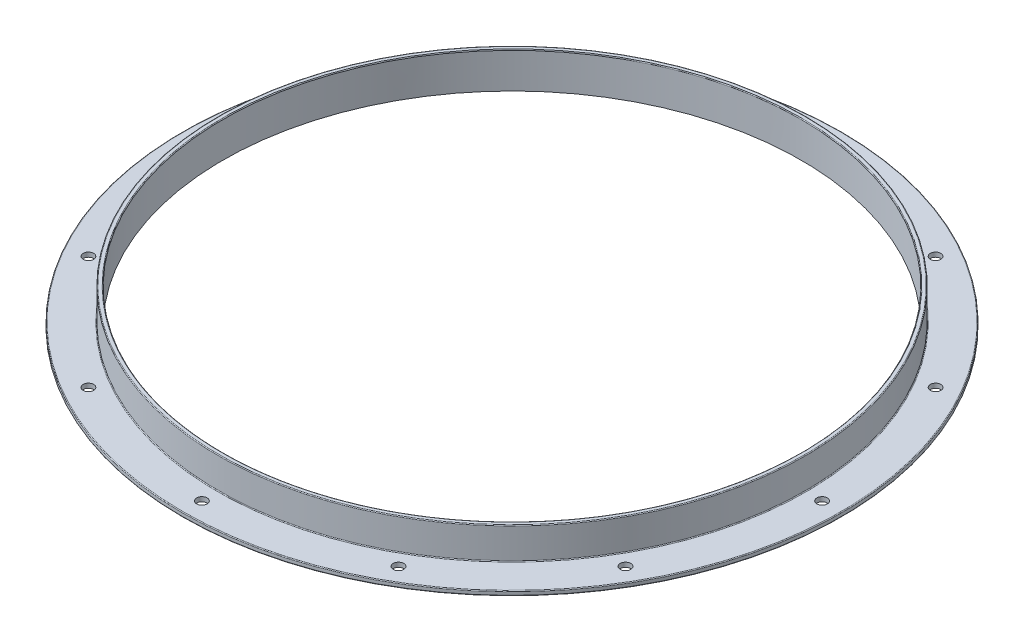
ISO-10303-21;
HEADER;
FILE_DESCRIPTION(('STEP AP214'),'2;1');
FILE_NAME('part.step','',(''),(''),'','','');
FILE_SCHEMA(('AUTOMOTIVE_DESIGN { 1 0 10303 214 1 1 1 1 }'));
ENDSEC;
DATA;
#1=APPLICATION_CONTEXT('core data for automotive mechanical design processes');
#2=APPLICATION_PROTOCOL_DEFINITION('international standard','automotive_design',2000,#1);
#3=PRODUCT_CONTEXT('',#1,'mechanical');
#4=PRODUCT('Part','Part','',(#3));
#5=PRODUCT_RELATED_PRODUCT_CATEGORY('part','',(#4));
#6=PRODUCT_DEFINITION_FORMATION('','',#4);
#7=PRODUCT_DEFINITION_CONTEXT('part definition',#1,'design');
#8=PRODUCT_DEFINITION('design','',#6,#7);
#9=PRODUCT_DEFINITION_SHAPE('','',#8);
#10=(LENGTH_UNIT() NAMED_UNIT(*) SI_UNIT(.MILLI.,.METRE.));
#11=(NAMED_UNIT(*) PLANE_ANGLE_UNIT() SI_UNIT($,.RADIAN.));
#12=(NAMED_UNIT(*) SI_UNIT($,.STERADIAN.) SOLID_ANGLE_UNIT());
#13=UNCERTAINTY_MEASURE_WITH_UNIT(LENGTH_MEASURE(1.E-05),#10,'distance_accuracy_value','');
#14=(GEOMETRIC_REPRESENTATION_CONTEXT(3) GLOBAL_UNCERTAINTY_ASSIGNED_CONTEXT((#13)) GLOBAL_UNIT_ASSIGNED_CONTEXT((#10,
#11,#12)) REPRESENTATION_CONTEXT('',''));
#15=CARTESIAN_POINT('',(0.,0.,0.));
#16=DIRECTION('',(0.,0.,1.));
#17=DIRECTION('',(1.,0.,0.));
#18=AXIS2_PLACEMENT_3D('',#15,#16,#17);
#19=CARTESIAN_POINT('',(0.,38.1,0.));
#20=DIRECTION('',(0.,1.,0.));
#21=DIRECTION('',(0.,0.,1.));
#22=AXIS2_PLACEMENT_3D('',#19,#20,#21);
#23=CYLINDRICAL_SURFACE('',#22,349.25);
#24=CARTESIAN_POINT('',(0.,0.793749999999989,0.));
#25=DIRECTION('',(0.,1.,0.));
#26=DIRECTION('',(0.,0.,1.));
#27=AXIS2_PLACEMENT_3D('',#24,#25,#26);
#28=CIRCLE('',#27,349.25);
#29=CARTESIAN_POINT('',(0.,0.793749999999975,349.25));
#30=VERTEX_POINT('',#29);
#31=EDGE_CURVE('E66',#30,#30,#28,.T.);
#32=ORIENTED_EDGE('',*,*,#31,.T.);
#33=EDGE_LOOP('',(#32));
#34=FACE_BOUND('',#33,.T.);
#35=CARTESIAN_POINT('',(0.,3.96874999999998,0.));
#36=DIRECTION('',(0.,-1.,0.));
#37=DIRECTION('',(0.,0.,-1.));
#38=AXIS2_PLACEMENT_3D('',#35,#36,#37);
#39=CIRCLE('',#38,349.25);
#40=CARTESIAN_POINT('',(0.,3.96874999999999,-349.25));
#41=VERTEX_POINT('',#40);
#42=EDGE_CURVE('E69',#41,#41,#39,.T.);
#43=ORIENTED_EDGE('',*,*,#42,.T.);
#44=EDGE_LOOP('',(#43));
#45=FACE_BOUND('',#44,.T.);
#46=ADVANCED_FACE('F34',(#34,#45),#23,.T.);
#47=CARTESIAN_POINT('',(0.,4.76249999999999,-349.25));
#48=DIRECTION('',(0.,-1.,0.));
#49=DIRECTION('',(0.,0.,-1.));
#50=AXIS2_PLACEMENT_3D('',#47,#48,#49);
#51=PLANE('',#50);
#52=CARTESIAN_POINT('',(164.306249999996,4.76249999999997,-284.586773001116));
#53=DIRECTION('',(0.,1.,0.));
#54=DIRECTION('',(-0.499999999999989,0.,0.866025403784445));
#55=AXIS2_PLACEMENT_3D('',#52,#53,#54);
#56=CIRCLE('',#55,5.55625000000002);
#57=CARTESIAN_POINT('',(161.528124999996,4.76249999999997,-279.774919351339));
#58=VERTEX_POINT('',#57);
#59=EDGE_CURVE('E142',#58,#58,#56,.T.);
#60=ORIENTED_EDGE('',*,*,#59,.F.);
#61=EDGE_LOOP('',(#60));
#62=FACE_BOUND('',#61,.T.);
#63=CARTESIAN_POINT('',(284.586773001112,4.76249999999997,-164.306250000003));
#64=DIRECTION('',(0.,1.,0.));
#65=DIRECTION('',(-0.866025403784433,0.,0.50000000000001));
#66=AXIS2_PLACEMENT_3D('',#63,#64,#65);
#67=CIRCLE('',#66,5.55625000000002);
#68=CARTESIAN_POINT('',(279.030523001112,4.76249999999997,-164.306250000003));
#69=VERTEX_POINT('',#68);
#70=EDGE_CURVE('E136',#69,#69,#67,.T.);
#71=ORIENTED_EDGE('',*,*,#70,.F.);
#72=EDGE_LOOP('',(#71));
#73=FACE_BOUND('',#72,.T.);
#74=CARTESIAN_POINT('',(328.6125,4.76249999999996,-3.4418388217024E-12));
#75=DIRECTION('',(0.,1.,0.));
#76=DIRECTION('',(-1.,0.,0.));
#77=AXIS2_PLACEMENT_3D('',#74,#75,#76);
#78=CIRCLE('',#77,5.55625000000002);
#79=CARTESIAN_POINT('',(323.05625,4.76249999999996,-3.38364019213556E-12));
#80=VERTEX_POINT('',#79);
#81=EDGE_CURVE('E130',#80,#80,#78,.T.);
#82=ORIENTED_EDGE('',*,*,#81,.F.);
#83=EDGE_LOOP('',(#82));
#84=FACE_BOUND('',#83,.T.);
#85=CARTESIAN_POINT('',(284.586773001115,4.76249999999995,164.306249999997));
#86=DIRECTION('',(0.,1.,0.));
#87=DIRECTION('',(-0.866025403784443,0.,-0.499999999999992));
#88=AXIS2_PLACEMENT_3D('',#85,#86,#87);
#89=CIRCLE('',#88,5.55625000000002);
#90=CARTESIAN_POINT('',(279.774919351338,4.76249999999995,161.528124999997));
#91=VERTEX_POINT('',#90);
#92=EDGE_CURVE('E124',#91,#91,#89,.T.);
#93=ORIENTED_EDGE('',*,*,#92,.F.);
#94=EDGE_LOOP('',(#93));
#95=FACE_BOUND('',#94,.T.);
#96=CARTESIAN_POINT('',(164.306250000002,4.76249999999995,284.586773001113));
#97=DIRECTION('',(0.,1.,0.));
#98=DIRECTION('',(-0.500000000000007,0.,-0.866025403784435));
#99=AXIS2_PLACEMENT_3D('',#96,#97,#98);
#100=CIRCLE('',#99,5.55625000000002);
#101=CARTESIAN_POINT('',(161.528125000002,4.76249999999995,279.774919351335));
#102=VERTEX_POINT('',#101);
#103=EDGE_CURVE('E118',#102,#102,#100,.T.);
#104=ORIENTED_EDGE('',*,*,#103,.F.);
#105=EDGE_LOOP('',(#104));
#106=FACE_BOUND('',#105,.T.);
#107=CARTESIAN_POINT('',(0.,4.76249999999995,328.6125));
#108=DIRECTION('',(0.,1.,0.));
#109=DIRECTION('',(0.,0.,-1.));
#110=AXIS2_PLACEMENT_3D('',#107,#108,#109);
#111=CIRCLE('',#110,5.55625000000002);
#112=CARTESIAN_POINT('',(0.,4.76249999999995,323.05625));
#113=VERTEX_POINT('',#112);
#114=EDGE_CURVE('E112',#113,#113,#111,.T.);
#115=ORIENTED_EDGE('',*,*,#114,.F.);
#116=EDGE_LOOP('',(#115));
#117=FACE_BOUND('',#116,.T.);
#118=CARTESIAN_POINT('',(-164.306249999998,4.76249999999995,284.586773001115));
#119=DIRECTION('',(0.,1.,0.));
#120=DIRECTION('',(0.499999999999995,0.,-0.866025403784442));
#121=AXIS2_PLACEMENT_3D('',#118,#119,#120);
#122=CIRCLE('',#121,5.55625000000002);
#123=CARTESIAN_POINT('',(-161.528124999998,4.76249999999995,279.774919351337));
#124=VERTEX_POINT('',#123);
#125=EDGE_CURVE('E106',#124,#124,#122,.T.);
#126=ORIENTED_EDGE('',*,*,#125,.F.);
#127=EDGE_LOOP('',(#126));
#128=FACE_BOUND('',#127,.T.);
#129=CARTESIAN_POINT('',(-284.586773001113,4.76249999999995,164.306250000001));
#130=DIRECTION('',(0.,1.,0.));
#131=DIRECTION('',(0.866025403784436,0.,-0.500000000000004));
#132=AXIS2_PLACEMENT_3D('',#129,#130,#131);
#133=CIRCLE('',#132,5.55625000000002);
#134=CARTESIAN_POINT('',(-279.774919351336,4.76249999999995,161.528125000001));
#135=VERTEX_POINT('',#134);
#136=EDGE_CURVE('E100',#135,#135,#133,.T.);
#137=ORIENTED_EDGE('',*,*,#136,.F.);
#138=EDGE_LOOP('',(#137));
#139=FACE_BOUND('',#138,.T.);
#140=CARTESIAN_POINT('',(-328.6125,4.76249999999996,1.14753882413995E-12));
#141=DIRECTION('',(0.,1.,0.));
#142=DIRECTION('',(1.,0.,0.));
#143=AXIS2_PLACEMENT_3D('',#140,#141,#142);
#144=CIRCLE('',#143,5.55625000000002);
#145=CARTESIAN_POINT('',(-323.05625,4.76249999999996,1.12813928095101E-12));
#146=VERTEX_POINT('',#145);
#147=EDGE_CURVE('E94',#146,#146,#144,.T.);
#148=ORIENTED_EDGE('',*,*,#147,.F.);
#149=EDGE_LOOP('',(#148));
#150=FACE_BOUND('',#149,.T.);
#151=CARTESIAN_POINT('',(-284.586773001114,4.76249999999997,-164.306249999999));
#152=DIRECTION('',(0.,1.,0.));
#153=DIRECTION('',(0.86602540378444,0.,0.499999999999998));
#154=AXIS2_PLACEMENT_3D('',#151,#152,#153);
#155=CIRCLE('',#154,5.55625000000002);
#156=CARTESIAN_POINT('',(-290.143023001114,4.76249999999997,-164.306249999999));
#157=VERTEX_POINT('',#156);
#158=EDGE_CURVE('E88',#157,#157,#155,.T.);
#159=ORIENTED_EDGE('',*,*,#158,.F.);
#160=EDGE_LOOP('',(#159));
#161=FACE_BOUND('',#160,.T.);
#162=CARTESIAN_POINT('',(-164.30625,4.76249999999997,-284.586773001114));
#163=DIRECTION('',(0.,1.,0.));
#164=DIRECTION('',(0.500000000000001,0.,0.866025403784438));
#165=AXIS2_PLACEMENT_3D('',#162,#163,#164);
#166=CIRCLE('',#165,5.55625000000002);
#167=CARTESIAN_POINT('',(-169.8625,4.76249999999997,-284.586773001114));
#168=VERTEX_POINT('',#167);
#169=EDGE_CURVE('E82',#168,#168,#166,.T.);
#170=ORIENTED_EDGE('',*,*,#169,.F.);
#171=EDGE_LOOP('',(#170));
#172=FACE_BOUND('',#171,.T.);
#173=CARTESIAN_POINT('',(0.,4.76249999999997,-328.6125));
#174=DIRECTION('',(0.,1.,0.));
#175=DIRECTION('',(0.,0.,1.));
#176=AXIS2_PLACEMENT_3D('',#173,#174,#175);
#177=CIRCLE('',#176,5.55625000000002);
#178=CARTESIAN_POINT('',(0.,4.76249999999997,-323.05625));
#179=VERTEX_POINT('',#178);
#180=EDGE_CURVE('E76',#179,#179,#177,.T.);
#181=ORIENTED_EDGE('',*,*,#180,.F.);
#182=EDGE_LOOP('',(#181));
#183=FACE_BOUND('',#182,.T.);
#184=CARTESIAN_POINT('',(0.,4.76249999999998,0.));
#185=DIRECTION('',(0.,-1.,0.));
#186=DIRECTION('',(0.,0.,-1.));
#187=AXIS2_PLACEMENT_3D('',#184,#185,#186);
#188=CIRCLE('',#187,311.94375);
#189=CARTESIAN_POINT('',(0.,4.76249999999999,-311.94375));
#190=VERTEX_POINT('',#189);
#191=EDGE_CURVE('E10',#190,#190,#188,.T.);
#192=ORIENTED_EDGE('',*,*,#191,.T.);
#193=EDGE_LOOP('',(#192));
#194=FACE_BOUND('',#193,.T.);
#195=CARTESIAN_POINT('',(0.,4.76249999999998,0.));
#196=DIRECTION('',(0.,-1.,0.));
#197=DIRECTION('',(0.,0.,-1.));
#198=AXIS2_PLACEMENT_3D('',#195,#196,#197);
#199=CIRCLE('',#198,348.45625);
#200=CARTESIAN_POINT('',(0.,4.76249999999999,-348.45625));
#201=VERTEX_POINT('',#200);
#202=EDGE_CURVE('E60',#201,#201,#199,.F.);
#203=ORIENTED_EDGE('',*,*,#202,.T.);
#204=EDGE_LOOP('',(#203));
#205=FACE_BOUND('',#204,.T.);
#206=ADVANCED_FACE('F158',(#62,#73,#84,#95,#106,#117,#128,#139,#150,#161,#172,#183,#194,#205),
#51,.F.);
#207=CARTESIAN_POINT('',(0.,38.1,0.));
#208=DIRECTION('',(0.,1.,0.));
#209=DIRECTION('',(0.,0.,1.));
#210=AXIS2_PLACEMENT_3D('',#207,#208,#209);
#211=CYLINDRICAL_SURFACE('',#210,311.15);
#212=CARTESIAN_POINT('',(0.,37.30625,0.));
#213=DIRECTION('',(0.,-1.,0.));
#214=DIRECTION('',(0.,0.,-1.));
#215=AXIS2_PLACEMENT_3D('',#212,#213,#214);
#216=CIRCLE('',#215,311.15);
#217=CARTESIAN_POINT('',(0.,37.30625,-311.15));
#218=VERTEX_POINT('',#217);
#219=EDGE_CURVE('E45',#218,#218,#216,.T.);
#220=ORIENTED_EDGE('',*,*,#219,.T.);
#221=EDGE_LOOP('',(#220));
#222=FACE_BOUND('',#221,.T.);
#223=CARTESIAN_POINT('',(0.,5.55624999999998,0.));
#224=DIRECTION('',(0.,-1.,0.));
#225=DIRECTION('',(0.,0.,-1.));
#226=AXIS2_PLACEMENT_3D('',#223,#224,#225);
#227=CIRCLE('',#226,311.15);
#228=CARTESIAN_POINT('',(0.,5.55624999999999,-311.15));
#229=VERTEX_POINT('',#228);
#230=EDGE_CURVE('E49',#229,#229,#227,.F.);
#231=ORIENTED_EDGE('',*,*,#230,.T.);
#232=EDGE_LOOP('',(#231));
#233=FACE_BOUND('',#232,.T.);
#234=ADVANCED_FACE('F161',(#222,#233),#211,.T.);
#235=CARTESIAN_POINT('',(0.,38.1,-311.15));
#236=DIRECTION('',(0.,-1.,0.));
#237=DIRECTION('',(0.,0.,-1.));
#238=AXIS2_PLACEMENT_3D('',#235,#236,#237);
#239=PLANE('',#238);
#240=CARTESIAN_POINT('',(0.,38.1,0.));
#241=DIRECTION('',(0.,-1.,0.));
#242=DIRECTION('',(0.,0.,-1.));
#243=AXIS2_PLACEMENT_3D('',#240,#241,#242);
#244=CIRCLE('',#243,310.35625);
#245=CARTESIAN_POINT('',(0.,38.1,-310.35625));
#246=VERTEX_POINT('',#245);
#247=EDGE_CURVE('E54',#246,#246,#244,.F.);
#248=ORIENTED_EDGE('',*,*,#247,.T.);
#249=EDGE_LOOP('',(#248));
#250=FACE_BOUND('',#249,.T.);
#251=CARTESIAN_POINT('',(0.,38.1,0.));
#252=DIRECTION('',(0.,-1.,0.));
#253=DIRECTION('',(0.,0.,-1.));
#254=AXIS2_PLACEMENT_3D('',#251,#252,#253);
#255=CIRCLE('',#254,307.18125);
#256=CARTESIAN_POINT('',(0.,38.1,-307.18125));
#257=VERTEX_POINT('',#256);
#258=EDGE_CURVE('E57',#257,#257,#255,.T.);
#259=ORIENTED_EDGE('',*,*,#258,.T.);
#260=EDGE_LOOP('',(#259));
#261=FACE_BOUND('',#260,.T.);
#262=ADVANCED_FACE('F212',(#250,#261),#239,.F.);
#263=CARTESIAN_POINT('',(0.,38.1,0.));
#264=DIRECTION('',(0.,1.,0.));
#265=DIRECTION('',(0.,0.,1.));
#266=AXIS2_PLACEMENT_3D('',#263,#264,#265);
#267=CYLINDRICAL_SURFACE('',#266,306.3875);
#268=CARTESIAN_POINT('',(0.,37.30625,0.));
#269=DIRECTION('',(0.,-1.,0.));
#270=DIRECTION('',(0.,0.,-1.));
#271=AXIS2_PLACEMENT_3D('',#268,#269,#270);
#272=CIRCLE('',#271,306.3875);
#273=CARTESIAN_POINT('',(0.,37.30625,-306.3875));
#274=VERTEX_POINT('',#273);
#275=EDGE_CURVE('E41',#274,#274,#272,.F.);
#276=ORIENTED_EDGE('',*,*,#275,.T.);
#277=EDGE_LOOP('',(#276));
#278=FACE_BOUND('',#277,.T.);
#279=CARTESIAN_POINT('',(0.,0.,0.));
#280=DIRECTION('',(0.,1.,0.));
#281=DIRECTION('',(0.,0.,1.));
#282=AXIS2_PLACEMENT_3D('',#279,#280,#281);
#283=CIRCLE('',#282,306.3875);
#284=CARTESIAN_POINT('',(0.,0.,306.3875));
#285=VERTEX_POINT('',#284);
#286=EDGE_CURVE('E72',#285,#285,#283,.T.);
#287=ORIENTED_EDGE('',*,*,#286,.F.);
#288=EDGE_LOOP('',(#287));
#289=FACE_BOUND('',#288,.T.);
#290=ADVANCED_FACE('F216',(#278,#289),#267,.F.);
#291=CARTESIAN_POINT('',(0.,0.,-306.3875));
#292=DIRECTION('',(0.,1.,0.));
#293=DIRECTION('',(0.,0.,1.));
#294=AXIS2_PLACEMENT_3D('',#291,#292,#293);
#295=PLANE('',#294);
#296=CARTESIAN_POINT('',(164.306249999996,0.,-284.586773001116));
#297=DIRECTION('',(0.,1.,0.));
#298=DIRECTION('',(-0.499999999999989,0.,0.866025403784445));
#299=AXIS2_PLACEMENT_3D('',#296,#297,#298);
#300=CIRCLE('',#299,5.55625000000002);
#301=CARTESIAN_POINT('',(161.528124999996,0.,-279.774919351339));
#302=VERTEX_POINT('',#301);
#303=EDGE_CURVE('E139',#302,#302,#300,.T.);
#304=ORIENTED_EDGE('',*,*,#303,.T.);
#305=EDGE_LOOP('',(#304));
#306=FACE_BOUND('',#305,.T.);
#307=CARTESIAN_POINT('',(284.586773001112,0.,-164.306250000003));
#308=DIRECTION('',(0.,1.,0.));
#309=DIRECTION('',(-0.866025403784433,0.,0.50000000000001));
#310=AXIS2_PLACEMENT_3D('',#307,#308,#309);
#311=CIRCLE('',#310,5.55625000000002);
#312=CARTESIAN_POINT('',(279.030523001112,0.,-164.306250000003));
#313=VERTEX_POINT('',#312);
#314=EDGE_CURVE('E133',#313,#313,#311,.T.);
#315=ORIENTED_EDGE('',*,*,#314,.T.);
#316=EDGE_LOOP('',(#315));
#317=FACE_BOUND('',#316,.T.);
#318=CARTESIAN_POINT('',(328.6125,-1.02348685082632E-13,-3.44203323438177E-12));
#319=DIRECTION('',(0.,1.,0.));
#320=DIRECTION('',(-1.,0.,0.));
#321=AXIS2_PLACEMENT_3D('',#318,#319,#320);
#322=CIRCLE('',#321,5.55625000000002);
#323=CARTESIAN_POINT('',(323.05625,-1.01985781414484E-13,-3.38383460481493E-12));
#324=VERTEX_POINT('',#323);
#325=EDGE_CURVE('E127',#324,#324,#322,.T.);
#326=ORIENTED_EDGE('',*,*,#325,.T.);
#327=EDGE_LOOP('',(#326));
#328=FACE_BOUND('',#327,.T.);
#329=CARTESIAN_POINT('',(284.586773001115,-1.17961196366423E-13,164.306249999997));
#330=DIRECTION('',(0.,1.,0.));
#331=DIRECTION('',(-0.866025403784443,0.,-0.499999999999992));
#332=AXIS2_PLACEMENT_3D('',#329,#330,#331);
#333=CIRCLE('',#332,5.55625000000002);
#334=CARTESIAN_POINT('',(279.774919351338,-1.1748488530198E-13,161.528124999997));
#335=VERTEX_POINT('',#334);
#336=EDGE_CURVE('E121',#335,#335,#333,.T.);
#337=ORIENTED_EDGE('',*,*,#336,.T.);
#338=EDGE_LOOP('',(#337));
#339=FACE_BOUND('',#338,.T.);
#340=CARTESIAN_POINT('',(164.306250000002,-1.23165366794353E-13,284.586773001113));
#341=DIRECTION('',(0.,1.,0.));
#342=DIRECTION('',(-0.500000000000007,0.,-0.866025403784435));
#343=AXIS2_PLACEMENT_3D('',#340,#341,#342);
#344=CIRCLE('',#343,5.55625000000002);
#345=CARTESIAN_POINT('',(161.528125000002,-1.22606035753867E-13,279.774919351335));
#346=VERTEX_POINT('',#345);
#347=EDGE_CURVE('E115',#346,#346,#344,.T.);
#348=ORIENTED_EDGE('',*,*,#347,.T.);
#349=EDGE_LOOP('',(#348));
#350=FACE_BOUND('',#349,.T.);
#351=CARTESIAN_POINT('',(0.,-1.16226472890446E-13,328.6125));
#352=DIRECTION('',(0.,1.,0.));
#353=DIRECTION('',(0.,0.,-1.));
#354=AXIS2_PLACEMENT_3D('',#351,#352,#353);
#355=CIRCLE('',#354,5.55625000000002);
#356=CARTESIAN_POINT('',(0.,-1.15636754429707E-13,323.05625));
#357=VERTEX_POINT('',#356);
#358=EDGE_CURVE('E109',#357,#357,#355,.T.);
#359=ORIENTED_EDGE('',*,*,#358,.T.);
#360=EDGE_LOOP('',(#359));
#361=FACE_BOUND('',#360,.T.);
#362=CARTESIAN_POINT('',(-164.306249999998,-1.23165366794353E-13,284.586773001115));
#363=DIRECTION('',(0.,1.,0.));
#364=DIRECTION('',(0.499999999999995,0.,-0.866025403784442));
#365=AXIS2_PLACEMENT_3D('',#362,#363,#364);
#366=CIRCLE('',#365,5.55625000000002);
#367=CARTESIAN_POINT('',(-161.528124999998,-1.22606035753867E-13,279.774919351337));
#368=VERTEX_POINT('',#367);
#369=EDGE_CURVE('E103',#368,#368,#366,.T.);
#370=ORIENTED_EDGE('',*,*,#369,.T.);
#371=EDGE_LOOP('',(#370));
#372=FACE_BOUND('',#371,.T.);
#373=CARTESIAN_POINT('',(-284.586773001113,-1.17961196366423E-13,164.306250000001));
#374=DIRECTION('',(0.,1.,0.));
#375=DIRECTION('',(0.866025403784436,0.,-0.500000000000004));
#376=AXIS2_PLACEMENT_3D('',#373,#374,#375);
#377=CIRCLE('',#376,5.55625000000002);
#378=CARTESIAN_POINT('',(-279.774919351336,-1.1748488530198E-13,161.528125000001));
#379=VERTEX_POINT('',#378);
#380=EDGE_CURVE('E97',#379,#379,#377,.T.);
#381=ORIENTED_EDGE('',*,*,#380,.T.);
#382=EDGE_LOOP('',(#381));
#383=FACE_BOUND('',#382,.T.);
#384=CARTESIAN_POINT('',(-328.6125,-1.02348685082632E-13,1.14734441146059E-12));
#385=DIRECTION('',(0.,1.,0.));
#386=DIRECTION('',(1.,0.,0.));
#387=AXIS2_PLACEMENT_3D('',#384,#385,#386);
#388=CIRCLE('',#387,5.55625000000002);
#389=CARTESIAN_POINT('',(-323.05625,-1.01985781414484E-13,1.12794486827164E-12));
#390=VERTEX_POINT('',#389);
#391=EDGE_CURVE('E91',#390,#390,#388,.T.);
#392=ORIENTED_EDGE('',*,*,#391,.T.);
#393=EDGE_LOOP('',(#392));
#394=FACE_BOUND('',#393,.T.);
#395=CARTESIAN_POINT('',(-284.586773001114,0.,-164.306249999999));
#396=DIRECTION('',(0.,1.,0.));
#397=DIRECTION('',(0.86602540378444,0.,0.499999999999998));
#398=AXIS2_PLACEMENT_3D('',#395,#396,#397);
#399=CIRCLE('',#398,5.55625000000002);
#400=CARTESIAN_POINT('',(-290.143023001114,0.,-164.306249999999));
#401=VERTEX_POINT('',#400);
#402=EDGE_CURVE('E85',#401,#401,#399,.T.);
#403=ORIENTED_EDGE('',*,*,#402,.T.);
#404=EDGE_LOOP('',(#403));
#405=FACE_BOUND('',#404,.T.);
#406=CARTESIAN_POINT('',(-164.30625,0.,-284.586773001114));
#407=DIRECTION('',(0.,1.,0.));
#408=DIRECTION('',(0.500000000000001,0.,0.866025403784438));
#409=AXIS2_PLACEMENT_3D('',#406,#407,#408);
#410=CIRCLE('',#409,5.55625000000002);
#411=CARTESIAN_POINT('',(-169.8625,0.,-284.586773001114));
#412=VERTEX_POINT('',#411);
#413=EDGE_CURVE('E79',#412,#412,#410,.T.);
#414=ORIENTED_EDGE('',*,*,#413,.T.);
#415=EDGE_LOOP('',(#414));
#416=FACE_BOUND('',#415,.T.);
#417=CARTESIAN_POINT('',(0.,0.,-328.6125));
#418=DIRECTION('',(0.,1.,0.));
#419=DIRECTION('',(0.,0.,1.));
#420=AXIS2_PLACEMENT_3D('',#417,#418,#419);
#421=CIRCLE('',#420,5.55625000000002);
#422=CARTESIAN_POINT('',(0.,0.,-323.05625));
#423=VERTEX_POINT('',#422);
#424=EDGE_CURVE('E75',#423,#423,#421,.T.);
#425=ORIENTED_EDGE('',*,*,#424,.T.);
#426=EDGE_LOOP('',(#425));
#427=FACE_BOUND('',#426,.T.);
#428=CARTESIAN_POINT('',(0.,0.,0.));
#429=DIRECTION('',(0.,1.,0.));
#430=DIRECTION('',(0.,0.,1.));
#431=AXIS2_PLACEMENT_3D('',#428,#429,#430);
#432=CIRCLE('',#431,348.45625);
#433=CARTESIAN_POINT('',(0.,0.,348.45625));
#434=VERTEX_POINT('',#433);
#435=EDGE_CURVE('E63',#434,#434,#432,.F.);
#436=ORIENTED_EDGE('',*,*,#435,.T.);
#437=EDGE_LOOP('',(#436));
#438=FACE_BOUND('',#437,.T.);
#439=ORIENTED_EDGE('',*,*,#286,.T.);
#440=EDGE_LOOP('',(#439));
#441=FACE_BOUND('',#440,.T.);
#442=ADVANCED_FACE('F148',(#306,#317,#328,#339,#350,#361,#372,#383,#394,#405,#416,#427,#438,
#441),#295,.F.);
#443=CARTESIAN_POINT('',(0.,0.793749999999989,0.));
#444=DIRECTION('',(0.,1.,0.));
#445=DIRECTION('',(0.,0.,1.));
#446=AXIS2_PLACEMENT_3D('',#443,#444,#445);
#447=TOROIDAL_SURFACE('',#446,348.45625,0.79375);
#448=ORIENTED_EDGE('',*,*,#435,.F.);
#449=EDGE_LOOP('',(#448));
#450=FACE_BOUND('',#449,.T.);
#451=ORIENTED_EDGE('',*,*,#31,.F.);
#452=EDGE_LOOP('',(#451));
#453=FACE_BOUND('',#452,.T.);
#454=ADVANCED_FACE('F190',(#450,#453),#447,.T.);
#455=CARTESIAN_POINT('',(0.,3.96874999999998,0.));
#456=DIRECTION('',(0.,-1.,0.));
#457=DIRECTION('',(0.,0.,-1.));
#458=AXIS2_PLACEMENT_3D('',#455,#456,#457);
#459=TOROIDAL_SURFACE('',#458,348.45625,0.79375);
#460=ORIENTED_EDGE('',*,*,#42,.F.);
#461=EDGE_LOOP('',(#460));
#462=FACE_BOUND('',#461,.T.);
#463=ORIENTED_EDGE('',*,*,#202,.F.);
#464=EDGE_LOOP('',(#463));
#465=FACE_BOUND('',#464,.T.);
#466=ADVANCED_FACE('F187',(#462,#465),#459,.T.);
#467=CARTESIAN_POINT('',(0.,37.30625,0.));
#468=DIRECTION('',(0.,-1.,0.));
#469=DIRECTION('',(0.,0.,-1.));
#470=AXIS2_PLACEMENT_3D('',#467,#468,#469);
#471=TOROIDAL_SURFACE('',#470,310.35625,0.79375);
#472=ORIENTED_EDGE('',*,*,#219,.F.);
#473=EDGE_LOOP('',(#472));
#474=FACE_BOUND('',#473,.T.);
#475=ORIENTED_EDGE('',*,*,#247,.F.);
#476=EDGE_LOOP('',(#475));
#477=FACE_BOUND('',#476,.T.);
#478=ADVANCED_FACE('F189',(#474,#477),#471,.T.);
#479=CARTESIAN_POINT('',(0.,37.30625,0.));
#480=DIRECTION('',(0.,-1.,0.));
#481=DIRECTION('',(0.,0.,-1.));
#482=AXIS2_PLACEMENT_3D('',#479,#480,#481);
#483=TOROIDAL_SURFACE('',#482,307.18125,0.79375);
#484=ORIENTED_EDGE('',*,*,#258,.F.);
#485=EDGE_LOOP('',(#484));
#486=FACE_BOUND('',#485,.T.);
#487=ORIENTED_EDGE('',*,*,#275,.F.);
#488=EDGE_LOOP('',(#487));
#489=FACE_BOUND('',#488,.T.);
#490=ADVANCED_FACE('F197',(#486,#489),#483,.T.);
#491=CARTESIAN_POINT('',(0.,5.55624999999998,0.));
#492=DIRECTION('',(0.,-1.,0.));
#493=DIRECTION('',(0.,0.,-1.));
#494=AXIS2_PLACEMENT_3D('',#491,#492,#493);
#495=TOROIDAL_SURFACE('',#494,311.94375,0.79375);
#496=ORIENTED_EDGE('',*,*,#191,.F.);
#497=EDGE_LOOP('',(#496));
#498=FACE_BOUND('',#497,.T.);
#499=ORIENTED_EDGE('',*,*,#230,.F.);
#500=EDGE_LOOP('',(#499));
#501=FACE_BOUND('',#500,.T.);
#502=ADVANCED_FACE('F36',(#498,#501),#495,.F.);
#503=CARTESIAN_POINT('',(0.,0.,-328.6125));
#504=DIRECTION('',(0.,1.,0.));
#505=DIRECTION('',(0.,0.,1.));
#506=AXIS2_PLACEMENT_3D('',#503,#504,#505);
#507=CYLINDRICAL_SURFACE('',#506,5.55625000000002);
#508=ORIENTED_EDGE('',*,*,#424,.F.);
#509=EDGE_LOOP('',(#508));
#510=FACE_BOUND('',#509,.T.);
#511=ORIENTED_EDGE('',*,*,#180,.T.);
#512=EDGE_LOOP('',(#511));
#513=FACE_BOUND('',#512,.T.);
#514=ADVANCED_FACE('F222',(#510,#513),#507,.F.);
#515=CARTESIAN_POINT('',(-164.30625,0.,-284.586773001114));
#516=DIRECTION('',(0.,1.,0.));
#517=DIRECTION('',(-1.,0.,0.));
#518=AXIS2_PLACEMENT_3D('',#515,#516,#517);
#519=CYLINDRICAL_SURFACE('',#518,5.55625000000002);
#520=CARTESIAN_POINT('',(-169.8625,0.,-284.586773001114));
#521=CARTESIAN_POINT('',(-169.8625,0.0496093749999291,-284.586773001114));
#522=CARTESIAN_POINT('',(-169.8625,0.0992187499999296,-284.586773001114));
#523=CARTESIAN_POINT('',(-169.8625,0.19843749999993,-284.586773001114));
#524=CARTESIAN_POINT('',(-169.8625,0.248046874999931,-284.586773001114));
#525=CARTESIAN_POINT('',(-169.8625,0.347265624999932,-284.586773001114));
#526=CARTESIAN_POINT('',(-169.8625,0.396874999999932,-284.586773001114));
#527=CARTESIAN_POINT('',(-169.8625,0.496093749999933,-284.586773001114));
#528=CARTESIAN_POINT('',(-169.8625,0.545703124999933,-284.586773001114));
#529=CARTESIAN_POINT('',(-169.8625,0.644921874999934,-284.586773001114));
#530=CARTESIAN_POINT('',(-169.8625,0.694531249999935,-284.586773001114));
#531=CARTESIAN_POINT('',(-169.8625,0.793749999999936,-284.586773001114));
#532=CARTESIAN_POINT('',(-169.8625,0.843359374999936,-284.586773001114));
#533=CARTESIAN_POINT('',(-169.8625,0.942578124999937,-284.586773001114));
#534=CARTESIAN_POINT('',(-169.8625,0.992187499999937,-284.586773001114));
#535=CARTESIAN_POINT('',(-169.8625,1.09140624999994,-284.586773001114));
#536=CARTESIAN_POINT('',(-169.8625,1.14101562499994,-284.586773001114));
#537=CARTESIAN_POINT('',(-169.8625,1.24023437499994,-284.586773001114));
#538=CARTESIAN_POINT('',(-169.8625,1.28984374999994,-284.586773001114));
#539=CARTESIAN_POINT('',(-169.8625,1.38906249999994,-284.586773001114));
#540=CARTESIAN_POINT('',(-169.8625,1.43867187499994,-284.586773001114));
#541=CARTESIAN_POINT('',(-169.8625,1.53789062499994,-284.586773001114));
#542=CARTESIAN_POINT('',(-169.8625,1.58749999999994,-284.586773001114));
#543=CARTESIAN_POINT('',(-169.8625,1.68671874999994,-284.586773001114));
#544=CARTESIAN_POINT('',(-169.8625,1.73632812499994,-284.586773001114));
#545=CARTESIAN_POINT('',(-169.8625,1.83554687499994,-284.586773001114));
#546=CARTESIAN_POINT('',(-169.8625,1.88515624999995,-284.586773001114));
#547=CARTESIAN_POINT('',(-169.8625,1.98437499999995,-284.586773001114));
#548=CARTESIAN_POINT('',(-169.8625,2.03398437499995,-284.586773001114));
#549=CARTESIAN_POINT('',(-169.8625,2.13320312499995,-284.586773001114));
#550=CARTESIAN_POINT('',(-169.8625,2.18281249999995,-284.586773001114));
#551=CARTESIAN_POINT('',(-169.8625,2.28203124999995,-284.586773001114));
#552=CARTESIAN_POINT('',(-169.8625,2.33164062499995,-284.586773001114));
#553=CARTESIAN_POINT('',(-169.8625,2.43085937499995,-284.586773001114));
#554=CARTESIAN_POINT('',(-169.8625,2.48046874999995,-284.586773001114));
#555=CARTESIAN_POINT('',(-169.8625,2.57968749999995,-284.586773001114));
#556=CARTESIAN_POINT('',(-169.8625,2.62929687499995,-284.586773001114));
#557=CARTESIAN_POINT('',(-169.8625,2.72851562499995,-284.586773001114));
#558=CARTESIAN_POINT('',(-169.8625,2.77812499999995,-284.586773001114));
#559=CARTESIAN_POINT('',(-169.8625,2.87734374999995,-284.586773001114));
#560=CARTESIAN_POINT('',(-169.8625,2.92695312499995,-284.586773001114));
#561=CARTESIAN_POINT('',(-169.8625,3.02617187499996,-284.586773001114));
#562=CARTESIAN_POINT('',(-169.8625,3.07578124999996,-284.586773001114));
#563=CARTESIAN_POINT('',(-169.8625,3.17499999999996,-284.586773001114));
#564=CARTESIAN_POINT('',(-169.8625,3.22460937499996,-284.586773001114));
#565=CARTESIAN_POINT('',(-169.8625,3.32382812499996,-284.586773001114));
#566=CARTESIAN_POINT('',(-169.8625,3.37343749999996,-284.586773001114));
#567=CARTESIAN_POINT('',(-169.8625,3.47265624999996,-284.586773001114));
#568=CARTESIAN_POINT('',(-169.8625,3.52226562499996,-284.586773001114));
#569=CARTESIAN_POINT('',(-169.8625,3.62148437499996,-284.586773001114));
#570=CARTESIAN_POINT('',(-169.8625,3.67109374999996,-284.586773001114));
#571=CARTESIAN_POINT('',(-169.8625,3.77031249999996,-284.586773001114));
#572=CARTESIAN_POINT('',(-169.8625,3.81992187499996,-284.586773001114));
#573=CARTESIAN_POINT('',(-169.8625,3.91914062499996,-284.586773001114));
#574=CARTESIAN_POINT('',(-169.8625,3.96874999999996,-284.586773001114));
#575=CARTESIAN_POINT('',(-169.8625,4.06796874999996,-284.586773001114));
#576=CARTESIAN_POINT('',(-169.8625,4.11757812499997,-284.586773001114));
#577=CARTESIAN_POINT('',(-169.8625,4.21679687499997,-284.586773001114));
#578=CARTESIAN_POINT('',(-169.8625,4.26640624999997,-284.586773001114));
#579=CARTESIAN_POINT('',(-169.8625,4.36562499999997,-284.586773001114));
#580=CARTESIAN_POINT('',(-169.8625,4.41523437499997,-284.586773001114));
#581=CARTESIAN_POINT('',(-169.8625,4.51445312499997,-284.586773001114));
#582=CARTESIAN_POINT('',(-169.8625,4.56406249999997,-284.586773001114));
#583=CARTESIAN_POINT('',(-169.8625,4.66328124999997,-284.586773001114));
#584=CARTESIAN_POINT('',(-169.8625,4.71289062499997,-284.586773001114));
#585=CARTESIAN_POINT('',(-169.8625,4.76249999999997,-284.586773001114));
#586=B_SPLINE_CURVE_WITH_KNOTS('',3,(#520,#521,#522,#523,#524,#525,#526,#527,#528,#529,#530,
#531,#532,#533,#534,#535,#536,#537,#538,#539,#540,#541,#542,#543,#544,#545,#546,#547,#548,#549,
#550,#551,#552,#553,#554,#555,#556,#557,#558,#559,#560,#561,#562,#563,#564,#565,#566,#567,#568,
#569,#570,#571,#572,#573,#574,#575,#576,#577,#578,#579,#580,#581,#582,#583,#584,#585),
.UNSPECIFIED.,.F.,.F.,(4,2,2,2,2,2,2,2,2,2,2,2,2,2,2,2,2,2,2,2,2,2,2,2,2,2,2,2,2,2,2,2,4),(0.,
0.148828125000001,0.297656250000003,0.446484375000004,0.595312500000005,0.744140625000007,
0.892968750000008,1.04179687500001,1.19062500000001,1.33945312500001,1.48828125000001,
1.63710937500001,1.78593750000002,1.93476562500002,2.08359375000002,2.23242187500002,
2.38125000000002,2.53007812500002,2.67890625000002,2.82773437500003,2.97656250000003,
3.12539062500003,3.27421875000003,3.42304687500003,3.57187500000003,3.72070312500003,
3.86953125000003,4.01835937500004,4.16718750000004,4.31601562500004,4.46484375000004,
4.61367187500004,4.76250000000004),.UNSPECIFIED.);
#587=EDGE_CURVE('BSEAM225',#412,#168,#586,.T.);
#588=ORIENTED_EDGE('',*,*,#413,.F.);
#589=ORIENTED_EDGE('',*,*,#169,.T.);
#590=ORIENTED_EDGE('',*,*,#587,.T.);
#591=ORIENTED_EDGE('',*,*,#587,.F.);
#592=EDGE_LOOP('',(#588,#590,#589,#591));
#593=FACE_BOUND('',#592,.T.);
#594=ADVANCED_FACE('F225',(#593),#519,.F.);
#595=CARTESIAN_POINT('',(-284.586773001114,0.,-164.306249999999));
#596=DIRECTION('',(0.,1.,0.));
#597=DIRECTION('',(-1.,0.,0.));
#598=AXIS2_PLACEMENT_3D('',#595,#596,#597);
#599=CYLINDRICAL_SURFACE('',#598,5.55625000000002);
#600=CARTESIAN_POINT('',(-290.143023001114,0.,-164.306249999999));
#601=CARTESIAN_POINT('',(-290.143023001114,0.0496093749999187,-164.306249999999));
#602=CARTESIAN_POINT('',(-290.143023001114,0.0992187499999191,-164.306249999999));
#603=CARTESIAN_POINT('',(-290.143023001114,0.19843749999992,-164.306249999999));
#604=CARTESIAN_POINT('',(-290.143023001114,0.248046874999921,-164.306249999999));
#605=CARTESIAN_POINT('',(-290.143023001114,0.347265624999922,-164.306249999999));
#606=CARTESIAN_POINT('',(-290.143023001114,0.396874999999922,-164.306249999999));
#607=CARTESIAN_POINT('',(-290.143023001114,0.496093749999923,-164.306249999999));
#608=CARTESIAN_POINT('',(-290.143023001114,0.545703124999924,-164.306249999999));
#609=CARTESIAN_POINT('',(-290.143023001114,0.644921874999924,-164.306249999999));
#610=CARTESIAN_POINT('',(-290.143023001114,0.694531249999925,-164.306249999999));
#611=CARTESIAN_POINT('',(-290.143023001114,0.793749999999926,-164.306249999999));
#612=CARTESIAN_POINT('',(-290.143023001114,0.843359374999927,-164.306249999999));
#613=CARTESIAN_POINT('',(-290.143023001114,0.942578124999928,-164.306249999999));
#614=CARTESIAN_POINT('',(-290.143023001114,0.992187499999928,-164.306249999999));
#615=CARTESIAN_POINT('',(-290.143023001114,1.09140624999993,-164.306249999999));
#616=CARTESIAN_POINT('',(-290.143023001114,1.14101562499993,-164.306249999999));
#617=CARTESIAN_POINT('',(-290.143023001114,1.24023437499993,-164.306249999999));
#618=CARTESIAN_POINT('',(-290.143023001114,1.28984374999993,-164.306249999999));
#619=CARTESIAN_POINT('',(-290.143023001114,1.38906249999993,-164.306249999999));
#620=CARTESIAN_POINT('',(-290.143023001114,1.43867187499993,-164.306249999999));
#621=CARTESIAN_POINT('',(-290.143023001114,1.53789062499993,-164.306249999999));
#622=CARTESIAN_POINT('',(-290.143023001114,1.58749999999993,-164.306249999999));
#623=CARTESIAN_POINT('',(-290.143023001114,1.68671874999993,-164.306249999999));
#624=CARTESIAN_POINT('',(-290.143023001114,1.73632812499994,-164.306249999999));
#625=CARTESIAN_POINT('',(-290.143023001114,1.83554687499994,-164.306249999999));
#626=CARTESIAN_POINT('',(-290.143023001114,1.88515624999994,-164.306249999999));
#627=CARTESIAN_POINT('',(-290.143023001114,1.98437499999994,-164.306249999999));
#628=CARTESIAN_POINT('',(-290.143023001114,2.03398437499994,-164.306249999999));
#629=CARTESIAN_POINT('',(-290.143023001114,2.13320312499994,-164.306249999999));
#630=CARTESIAN_POINT('',(-290.143023001114,2.18281249999994,-164.306249999999));
#631=CARTESIAN_POINT('',(-290.143023001114,2.28203124999994,-164.306249999999));
#632=CARTESIAN_POINT('',(-290.143023001114,2.33164062499994,-164.306249999999));
#633=CARTESIAN_POINT('',(-290.143023001114,2.43085937499994,-164.306249999999));
#634=CARTESIAN_POINT('',(-290.143023001114,2.48046874999994,-164.306249999999));
#635=CARTESIAN_POINT('',(-290.143023001114,2.57968749999994,-164.306249999999));
#636=CARTESIAN_POINT('',(-290.143023001114,2.62929687499994,-164.306249999999));
#637=CARTESIAN_POINT('',(-290.143023001114,2.72851562499994,-164.306249999999));
#638=CARTESIAN_POINT('',(-290.143023001114,2.77812499999995,-164.306249999999));
#639=CARTESIAN_POINT('',(-290.143023001114,2.87734374999995,-164.306249999999));
#640=CARTESIAN_POINT('',(-290.143023001114,2.92695312499995,-164.306249999999));
#641=CARTESIAN_POINT('',(-290.143023001114,3.02617187499995,-164.306249999999));
#642=CARTESIAN_POINT('',(-290.143023001114,3.07578124999995,-164.306249999999));
#643=CARTESIAN_POINT('',(-290.143023001114,3.17499999999995,-164.306249999999));
#644=CARTESIAN_POINT('',(-290.143023001114,3.22460937499995,-164.306249999999));
#645=CARTESIAN_POINT('',(-290.143023001114,3.32382812499995,-164.306249999999));
#646=CARTESIAN_POINT('',(-290.143023001114,3.37343749999995,-164.306249999999));
#647=CARTESIAN_POINT('',(-290.143023001114,3.47265624999995,-164.306249999999));
#648=CARTESIAN_POINT('',(-290.143023001114,3.52226562499995,-164.306249999999));
#649=CARTESIAN_POINT('',(-290.143023001114,3.62148437499995,-164.306249999999));
#650=CARTESIAN_POINT('',(-290.143023001114,3.67109374999995,-164.306249999999));
#651=CARTESIAN_POINT('',(-290.143023001114,3.77031249999996,-164.306249999999));
#652=CARTESIAN_POINT('',(-290.143023001114,3.81992187499996,-164.306249999999));
#653=CARTESIAN_POINT('',(-290.143023001114,3.91914062499996,-164.306249999999));
#654=CARTESIAN_POINT('',(-290.143023001114,3.96874999999996,-164.306249999999));
#655=CARTESIAN_POINT('',(-290.143023001114,4.06796874999996,-164.306249999999));
#656=CARTESIAN_POINT('',(-290.143023001114,4.11757812499996,-164.306249999999));
#657=CARTESIAN_POINT('',(-290.143023001114,4.21679687499996,-164.306249999999));
#658=CARTESIAN_POINT('',(-290.143023001114,4.26640624999996,-164.306249999999));
#659=CARTESIAN_POINT('',(-290.143023001114,4.36562499999996,-164.306249999999));
#660=CARTESIAN_POINT('',(-290.143023001114,4.41523437499996,-164.306249999999));
#661=CARTESIAN_POINT('',(-290.143023001114,4.51445312499996,-164.306249999999));
#662=CARTESIAN_POINT('',(-290.143023001114,4.56406249999996,-164.306249999999));
#663=CARTESIAN_POINT('',(-290.143023001114,4.66328124999996,-164.306249999999));
#664=CARTESIAN_POINT('',(-290.143023001114,4.71289062499997,-164.306249999999));
#665=CARTESIAN_POINT('',(-290.143023001114,4.76249999999997,-164.306249999999));
#666=B_SPLINE_CURVE_WITH_KNOTS('',3,(#600,#601,#602,#603,#604,#605,#606,#607,#608,#609,#610,
#611,#612,#613,#614,#615,#616,#617,#618,#619,#620,#621,#622,#623,#624,#625,#626,#627,#628,#629,
#630,#631,#632,#633,#634,#635,#636,#637,#638,#639,#640,#641,#642,#643,#644,#645,#646,#647,#648,
#649,#650,#651,#652,#653,#654,#655,#656,#657,#658,#659,#660,#661,#662,#663,#664,#665),
.UNSPECIFIED.,.F.,.F.,(4,2,2,2,2,2,2,2,2,2,2,2,2,2,2,2,2,2,2,2,2,2,2,2,2,2,2,2,2,2,2,2,4),(0.,
0.148828125000001,0.297656250000003,0.446484375000004,0.595312500000006,0.744140625000007,
0.892968750000009,1.04179687500001,1.19062500000001,1.33945312500001,1.48828125000001,
1.63710937500002,1.78593750000002,1.93476562500002,2.08359375000002,2.23242187500002,
2.38125000000002,2.53007812500003,2.67890625000003,2.82773437500003,2.97656250000003,
3.12539062500003,3.27421875000003,3.42304687500003,3.57187500000004,3.72070312500004,
3.86953125000004,4.01835937500004,4.16718750000004,4.31601562500004,4.46484375000005,
4.61367187500005,4.76250000000005),.UNSPECIFIED.);
#667=EDGE_CURVE('BSEAM229',#401,#157,#666,.T.);
#668=ORIENTED_EDGE('',*,*,#402,.F.);
#669=ORIENTED_EDGE('',*,*,#158,.T.);
#670=ORIENTED_EDGE('',*,*,#667,.T.);
#671=ORIENTED_EDGE('',*,*,#667,.F.);
#672=EDGE_LOOP('',(#668,#670,#669,#671));
#673=FACE_BOUND('',#672,.T.);
#674=ADVANCED_FACE('F229',(#673),#599,.F.);
#675=CARTESIAN_POINT('',(-328.6125,-1.02348685082632E-13,1.14734441146059E-12));
#676=DIRECTION('',(0.,1.,0.));
#677=DIRECTION('',(-1.,0.,0.));
#678=AXIS2_PLACEMENT_3D('',#675,#676,#677);
#679=CYLINDRICAL_SURFACE('',#678,5.55625000000002);
#680=ORIENTED_EDGE('',*,*,#391,.F.);
#681=EDGE_LOOP('',(#680));
#682=FACE_BOUND('',#681,.T.);
#683=ORIENTED_EDGE('',*,*,#147,.T.);
#684=EDGE_LOOP('',(#683));
#685=FACE_BOUND('',#684,.T.);
#686=ADVANCED_FACE('F233',(#682,#685),#679,.F.);
#687=CARTESIAN_POINT('',(-284.586773001113,-1.17961196366423E-13,164.306250000001));
#688=DIRECTION('',(0.,1.,0.));
#689=DIRECTION('',(0.,0.,1.));
#690=AXIS2_PLACEMENT_3D('',#687,#688,#689);
#691=CYLINDRICAL_SURFACE('',#690,5.55625000000002);
#692=ORIENTED_EDGE('',*,*,#380,.F.);
#693=EDGE_LOOP('',(#692));
#694=FACE_BOUND('',#693,.T.);
#695=ORIENTED_EDGE('',*,*,#136,.T.);
#696=EDGE_LOOP('',(#695));
#697=FACE_BOUND('',#696,.T.);
#698=ADVANCED_FACE('F237',(#694,#697),#691,.F.);
#699=CARTESIAN_POINT('',(-164.306249999998,-1.23165366794353E-13,284.586773001115));
#700=DIRECTION('',(0.,1.,0.));
#701=DIRECTION('',(0.,0.,1.));
#702=AXIS2_PLACEMENT_3D('',#699,#700,#701);
#703=CYLINDRICAL_SURFACE('',#702,5.55625000000002);
#704=ORIENTED_EDGE('',*,*,#369,.F.);
#705=EDGE_LOOP('',(#704));
#706=FACE_BOUND('',#705,.T.);
#707=ORIENTED_EDGE('',*,*,#125,.T.);
#708=EDGE_LOOP('',(#707));
#709=FACE_BOUND('',#708,.T.);
#710=ADVANCED_FACE('F241',(#706,#709),#703,.F.);
#711=CARTESIAN_POINT('',(0.,-1.16226472890446E-13,328.6125));
#712=DIRECTION('',(0.,1.,0.));
#713=DIRECTION('',(0.,0.,1.));
#714=AXIS2_PLACEMENT_3D('',#711,#712,#713);
#715=CYLINDRICAL_SURFACE('',#714,5.55625000000002);
#716=ORIENTED_EDGE('',*,*,#358,.F.);
#717=EDGE_LOOP('',(#716));
#718=FACE_BOUND('',#717,.T.);
#719=ORIENTED_EDGE('',*,*,#114,.T.);
#720=EDGE_LOOP('',(#719));
#721=FACE_BOUND('',#720,.T.);
#722=ADVANCED_FACE('F245',(#718,#721),#715,.F.);
#723=CARTESIAN_POINT('',(164.306250000002,-1.23165366794353E-13,284.586773001113));
#724=DIRECTION('',(0.,1.,0.));
#725=DIRECTION('',(0.,0.,1.));
#726=AXIS2_PLACEMENT_3D('',#723,#724,#725);
#727=CYLINDRICAL_SURFACE('',#726,5.55625000000002);
#728=ORIENTED_EDGE('',*,*,#347,.F.);
#729=EDGE_LOOP('',(#728));
#730=FACE_BOUND('',#729,.T.);
#731=ORIENTED_EDGE('',*,*,#103,.T.);
#732=EDGE_LOOP('',(#731));
#733=FACE_BOUND('',#732,.T.);
#734=ADVANCED_FACE('F249',(#730,#733),#727,.F.);
#735=CARTESIAN_POINT('',(284.586773001115,-1.17961196366423E-13,164.306249999997));
#736=DIRECTION('',(0.,1.,0.));
#737=DIRECTION('',(0.,0.,1.));
#738=AXIS2_PLACEMENT_3D('',#735,#736,#737);
#739=CYLINDRICAL_SURFACE('',#738,5.55625000000002);
#740=ORIENTED_EDGE('',*,*,#336,.F.);
#741=EDGE_LOOP('',(#740));
#742=FACE_BOUND('',#741,.T.);
#743=ORIENTED_EDGE('',*,*,#92,.T.);
#744=EDGE_LOOP('',(#743));
#745=FACE_BOUND('',#744,.T.);
#746=ADVANCED_FACE('F253',(#742,#745),#739,.F.);
#747=CARTESIAN_POINT('',(328.6125,-1.02348685082632E-13,-3.44203323438177E-12));
#748=DIRECTION('',(0.,1.,0.));
#749=DIRECTION('',(-1.,0.,0.));
#750=AXIS2_PLACEMENT_3D('',#747,#748,#749);
#751=CYLINDRICAL_SURFACE('',#750,5.55625000000002);
#752=ORIENTED_EDGE('',*,*,#325,.F.);
#753=EDGE_LOOP('',(#752));
#754=FACE_BOUND('',#753,.T.);
#755=ORIENTED_EDGE('',*,*,#81,.T.);
#756=EDGE_LOOP('',(#755));
#757=FACE_BOUND('',#756,.T.);
#758=ADVANCED_FACE('F257',(#754,#757),#751,.F.);
#759=CARTESIAN_POINT('',(284.586773001112,0.,-164.306250000003));
#760=DIRECTION('',(0.,1.,0.));
#761=DIRECTION('',(-1.,0.,0.));
#762=AXIS2_PLACEMENT_3D('',#759,#760,#761);
#763=CYLINDRICAL_SURFACE('',#762,5.55625000000002);
#764=CARTESIAN_POINT('',(279.030523001112,0.,-164.306250000003));
#765=CARTESIAN_POINT('',(279.030523001112,0.0496093749999193,-164.306250000003));
#766=CARTESIAN_POINT('',(279.030523001112,0.0992187499999198,-164.306250000003));
#767=CARTESIAN_POINT('',(279.030523001112,0.198437499999921,-164.306250000003));
#768=CARTESIAN_POINT('',(279.030523001112,0.248046874999921,-164.306250000003));
#769=CARTESIAN_POINT('',(279.030523001112,0.347265624999922,-164.306250000003));
#770=CARTESIAN_POINT('',(279.030523001112,0.396874999999923,-164.306250000003));
#771=CARTESIAN_POINT('',(279.030523001112,0.496093749999924,-164.306250000003));
#772=CARTESIAN_POINT('',(279.030523001112,0.545703124999924,-164.306250000003));
#773=CARTESIAN_POINT('',(279.030523001112,0.644921874999925,-164.306250000003));
#774=CARTESIAN_POINT('',(279.030523001112,0.694531249999926,-164.306250000003));
#775=CARTESIAN_POINT('',(279.030523001112,0.793749999999927,-164.306250000003));
#776=CARTESIAN_POINT('',(279.030523001112,0.843359374999928,-164.306250000003));
#777=CARTESIAN_POINT('',(279.030523001112,0.942578124999928,-164.306250000003));
#778=CARTESIAN_POINT('',(279.030523001112,0.992187499999929,-164.306250000003));
#779=CARTESIAN_POINT('',(279.030523001112,1.09140624999993,-164.306250000003));
#780=CARTESIAN_POINT('',(279.030523001112,1.14101562499993,-164.306250000003));
#781=CARTESIAN_POINT('',(279.030523001112,1.24023437499993,-164.306250000003));
#782=CARTESIAN_POINT('',(279.030523001112,1.28984374999993,-164.306250000003));
#783=CARTESIAN_POINT('',(279.030523001112,1.38906249999993,-164.306250000003));
#784=CARTESIAN_POINT('',(279.030523001112,1.43867187499993,-164.306250000003));
#785=CARTESIAN_POINT('',(279.030523001112,1.53789062499993,-164.306250000003));
#786=CARTESIAN_POINT('',(279.030523001112,1.58749999999994,-164.306250000003));
#787=CARTESIAN_POINT('',(279.030523001112,1.68671874999994,-164.306250000003));
#788=CARTESIAN_POINT('',(279.030523001112,1.73632812499994,-164.306250000003));
#789=CARTESIAN_POINT('',(279.030523001112,1.83554687499994,-164.306250000003));
#790=CARTESIAN_POINT('',(279.030523001112,1.88515624999994,-164.306250000003));
#791=CARTESIAN_POINT('',(279.030523001112,1.98437499999994,-164.306250000003));
#792=CARTESIAN_POINT('',(279.030523001112,2.03398437499994,-164.306250000003));
#793=CARTESIAN_POINT('',(279.030523001112,2.13320312499994,-164.306250000003));
#794=CARTESIAN_POINT('',(279.030523001112,2.18281249999994,-164.306250000003));
#795=CARTESIAN_POINT('',(279.030523001112,2.28203124999994,-164.306250000003));
#796=CARTESIAN_POINT('',(279.030523001112,2.33164062499994,-164.306250000003));
#797=CARTESIAN_POINT('',(279.030523001112,2.43085937499994,-164.306250000003));
#798=CARTESIAN_POINT('',(279.030523001112,2.48046874999994,-164.306250000003));
#799=CARTESIAN_POINT('',(279.030523001112,2.57968749999995,-164.306250000003));
#800=CARTESIAN_POINT('',(279.030523001112,2.62929687499995,-164.306250000003));
#801=CARTESIAN_POINT('',(279.030523001112,2.72851562499995,-164.306250000003));
#802=CARTESIAN_POINT('',(279.030523001112,2.77812499999995,-164.306250000003));
#803=CARTESIAN_POINT('',(279.030523001112,2.87734374999995,-164.306250000003));
#804=CARTESIAN_POINT('',(279.030523001112,2.92695312499995,-164.306250000003));
#805=CARTESIAN_POINT('',(279.030523001112,3.02617187499995,-164.306250000003));
#806=CARTESIAN_POINT('',(279.030523001112,3.07578124999995,-164.306250000003));
#807=CARTESIAN_POINT('',(279.030523001112,3.17499999999995,-164.306250000003));
#808=CARTESIAN_POINT('',(279.030523001112,3.22460937499995,-164.306250000003));
#809=CARTESIAN_POINT('',(279.030523001112,3.32382812499995,-164.306250000003));
#810=CARTESIAN_POINT('',(279.030523001112,3.37343749999995,-164.306250000003));
#811=CARTESIAN_POINT('',(279.030523001112,3.47265624999996,-164.306250000003));
#812=CARTESIAN_POINT('',(279.030523001112,3.52226562499996,-164.306250000003));
#813=CARTESIAN_POINT('',(279.030523001112,3.62148437499996,-164.306250000003));
#814=CARTESIAN_POINT('',(279.030523001112,3.67109374999996,-164.306250000003));
#815=CARTESIAN_POINT('',(279.030523001112,3.77031249999996,-164.306250000003));
#816=CARTESIAN_POINT('',(279.030523001112,3.81992187499996,-164.306250000003));
#817=CARTESIAN_POINT('',(279.030523001112,3.91914062499996,-164.306250000003));
#818=CARTESIAN_POINT('',(279.030523001112,3.96874999999996,-164.306250000003));
#819=CARTESIAN_POINT('',(279.030523001112,4.06796874999996,-164.306250000003));
#820=CARTESIAN_POINT('',(279.030523001112,4.11757812499996,-164.306250000003));
#821=CARTESIAN_POINT('',(279.030523001112,4.21679687499996,-164.306250000003));
#822=CARTESIAN_POINT('',(279.030523001112,4.26640624999996,-164.306250000003));
#823=CARTESIAN_POINT('',(279.030523001112,4.36562499999996,-164.306250000003));
#824=CARTESIAN_POINT('',(279.030523001112,4.41523437499996,-164.306250000003));
#825=CARTESIAN_POINT('',(279.030523001112,4.51445312499997,-164.306250000003));
#826=CARTESIAN_POINT('',(279.030523001112,4.56406249999996,-164.306250000003));
#827=CARTESIAN_POINT('',(279.030523001112,4.66328124999997,-164.306250000003));
#828=CARTESIAN_POINT('',(279.030523001112,4.71289062499997,-164.306250000003));
#829=CARTESIAN_POINT('',(279.030523001112,4.76249999999997,-164.306250000003));
#830=B_SPLINE_CURVE_WITH_KNOTS('',3,(#764,#765,#766,#767,#768,#769,#770,#771,#772,#773,#774,
#775,#776,#777,#778,#779,#780,#781,#782,#783,#784,#785,#786,#787,#788,#789,#790,#791,#792,#793,
#794,#795,#796,#797,#798,#799,#800,#801,#802,#803,#804,#805,#806,#807,#808,#809,#810,#811,#812,
#813,#814,#815,#816,#817,#818,#819,#820,#821,#822,#823,#824,#825,#826,#827,#828,#829),
.UNSPECIFIED.,.F.,.F.,(4,2,2,2,2,2,2,2,2,2,2,2,2,2,2,2,2,2,2,2,2,2,2,2,2,2,2,2,2,2,2,2,4),(0.,
0.148828125000002,0.297656250000003,0.446484375000005,0.595312500000006,0.744140625000008,
0.892968750000009,1.04179687500001,1.19062500000001,1.33945312500001,1.48828125000002,
1.63710937500002,1.78593750000002,1.93476562500002,2.08359375000002,2.23242187500002,
2.38125000000002,2.53007812500003,2.67890625000003,2.82773437500003,2.97656250000003,
3.12539062500003,3.27421875000003,3.42304687500004,3.57187500000004,3.72070312500004,
3.86953125000004,4.01835937500004,4.16718750000004,4.31601562500004,4.46484375000005,
4.61367187500005,4.76250000000005),.UNSPECIFIED.);
#831=EDGE_CURVE('BSEAM154',#313,#69,#830,.T.);
#832=ORIENTED_EDGE('',*,*,#314,.F.);
#833=ORIENTED_EDGE('',*,*,#70,.T.);
#834=ORIENTED_EDGE('',*,*,#831,.T.);
#835=ORIENTED_EDGE('',*,*,#831,.F.);
#836=EDGE_LOOP('',(#832,#834,#833,#835));
#837=FACE_BOUND('',#836,.T.);
#838=ADVANCED_FACE('F154',(#837),#763,.F.);
#839=CARTESIAN_POINT('',(164.306249999996,0.,-284.586773001116));
#840=DIRECTION('',(0.,1.,0.));
#841=DIRECTION('',(-1.,0.,0.));
#842=AXIS2_PLACEMENT_3D('',#839,#840,#841);
#843=CYLINDRICAL_SURFACE('',#842,5.55625000000002);
#844=ORIENTED_EDGE('',*,*,#303,.F.);
#845=EDGE_LOOP('',(#844));
#846=FACE_BOUND('',#845,.T.);
#847=ORIENTED_EDGE('',*,*,#59,.T.);
#848=EDGE_LOOP('',(#847));
#849=FACE_BOUND('',#848,.T.);
#850=ADVANCED_FACE('F151',(#846,#849),#843,.F.);
#851=CLOSED_SHELL('',(#46,#206,#234,#262,#290,#442,#454,#466,#478,#490,#502,#514,#594,#674,#686,
#698,#710,#722,#734,#746,#758,#838,#850));
#852=MANIFOLD_SOLID_BREP('B2',#851);
#853=ADVANCED_BREP_SHAPE_REPRESENTATION('',(#18,#852),#14);
#854=SHAPE_DEFINITION_REPRESENTATION(#9,#853);
ENDSEC;
END-ISO-10303-21;
